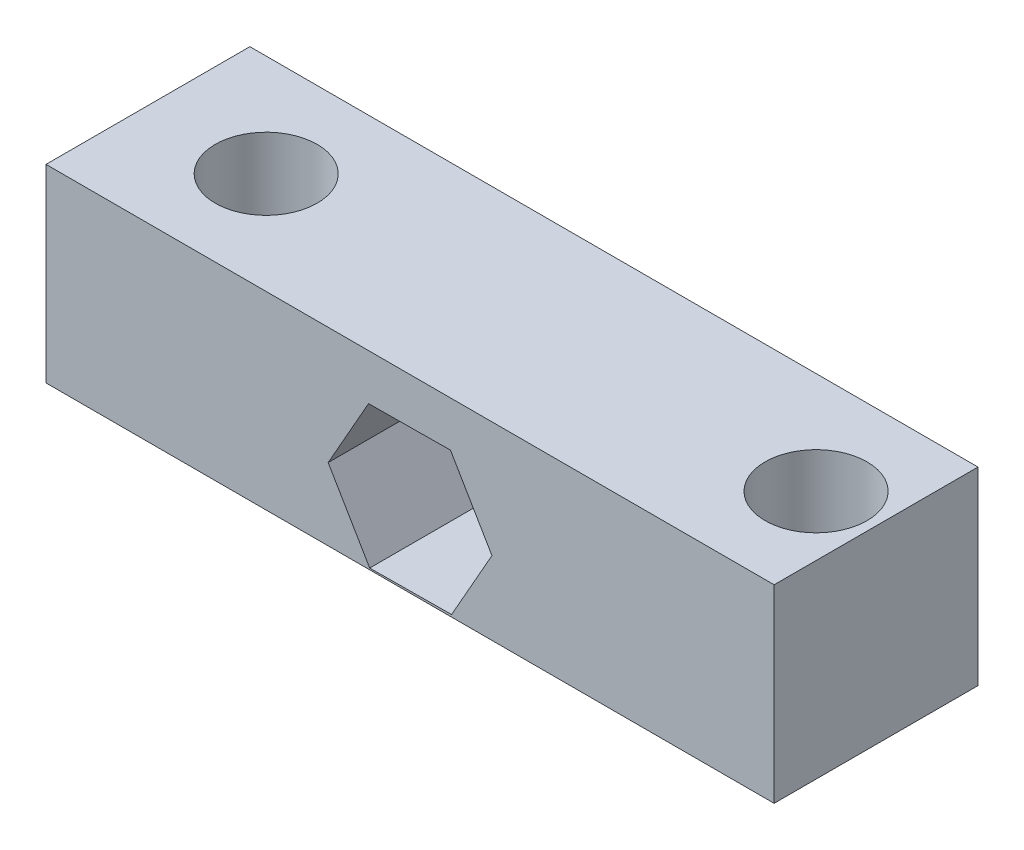
ISO-10303-21;
HEADER;
FILE_DESCRIPTION(('STEP AP214'),'2;1');
FILE_NAME('part.step','',(''),(''),'','','');
FILE_SCHEMA(('AUTOMOTIVE_DESIGN { 1 0 10303 214 1 1 1 1 }'));
ENDSEC;
DATA;
#1=APPLICATION_CONTEXT('core data for automotive mechanical design processes');
#2=APPLICATION_PROTOCOL_DEFINITION('international standard','automotive_design',2000,#1);
#3=PRODUCT_CONTEXT('',#1,'mechanical');
#4=PRODUCT('Part','Part','',(#3));
#5=PRODUCT_RELATED_PRODUCT_CATEGORY('part','',(#4));
#6=PRODUCT_DEFINITION_FORMATION('','',#4);
#7=PRODUCT_DEFINITION_CONTEXT('part definition',#1,'design');
#8=PRODUCT_DEFINITION('design','',#6,#7);
#9=PRODUCT_DEFINITION_SHAPE('','',#8);
#10=(LENGTH_UNIT() NAMED_UNIT(*) SI_UNIT(.MILLI.,.METRE.));
#11=(NAMED_UNIT(*) PLANE_ANGLE_UNIT() SI_UNIT($,.RADIAN.));
#12=(NAMED_UNIT(*) SI_UNIT($,.STERADIAN.) SOLID_ANGLE_UNIT());
#13=UNCERTAINTY_MEASURE_WITH_UNIT(LENGTH_MEASURE(1.E-05),#10,'distance_accuracy_value','');
#14=(GEOMETRIC_REPRESENTATION_CONTEXT(3) GLOBAL_UNCERTAINTY_ASSIGNED_CONTEXT((#13)) GLOBAL_UNIT_ASSIGNED_CONTEXT((#10,
#11,#12)) REPRESENTATION_CONTEXT('',''));
#15=CARTESIAN_POINT('',(0.,0.,0.));
#16=DIRECTION('',(0.,0.,1.));
#17=DIRECTION('',(1.,0.,0.));
#18=AXIS2_PLACEMENT_3D('',#15,#16,#17);
#19=CARTESIAN_POINT('',(0.,6.5,0.));
#20=DIRECTION('',(0.,1.,0.));
#21=DIRECTION('',(0.,0.,1.));
#22=AXIS2_PLACEMENT_3D('',#19,#20,#21);
#23=PLANE('',#22);
#24=CARTESIAN_POINT('',(10.44,6.5,0.));
#25=DIRECTION('',(0.,1.,0.));
#26=DIRECTION('',(0.,0.,1.));
#27=AXIS2_PLACEMENT_3D('',#24,#25,#26);
#28=CIRCLE('',#27,1.75);
#29=CARTESIAN_POINT('',(10.44,6.5,-1.75000000000002));
#30=VERTEX_POINT('',#29);
#31=EDGE_CURVE('E196',#30,#30,#28,.T.);
#32=ORIENTED_EDGE('',*,*,#31,.F.);
#33=EDGE_LOOP('',(#32));
#34=FACE_BOUND('',#33,.T.);
#35=DIRECTION('',(0.,0.,-1.));
#36=VECTOR('',#35,1.);
#37=CARTESIAN_POINT('',(12.5,6.5,-3.5));
#38=LINE('',#37,#36);
#39=CARTESIAN_POINT('',(12.5,6.5,3.5));
#40=VERTEX_POINT('',#39);
#41=CARTESIAN_POINT('',(12.5,6.5,-3.5));
#42=VERTEX_POINT('',#41);
#43=EDGE_CURVE('E204',#40,#42,#38,.T.);
#44=ORIENTED_EDGE('',*,*,#43,.T.);
#45=DIRECTION('',(-1.,0.,0.));
#46=VECTOR('',#45,1.);
#47=CARTESIAN_POINT('',(-12.5,6.5,-3.5));
#48=LINE('',#47,#46);
#49=CARTESIAN_POINT('',(-12.5,6.5,-3.5));
#50=VERTEX_POINT('',#49);
#51=EDGE_CURVE('E208',#42,#50,#48,.T.);
#52=ORIENTED_EDGE('',*,*,#51,.T.);
#53=DIRECTION('',(0.,0.,1.));
#54=VECTOR('',#53,1.);
#55=CARTESIAN_POINT('',(-12.5,6.5,-3.5));
#56=LINE('',#55,#54);
#57=CARTESIAN_POINT('',(-12.5,6.5,3.5));
#58=VERTEX_POINT('',#57);
#59=EDGE_CURVE('E212',#50,#58,#56,.T.);
#60=ORIENTED_EDGE('',*,*,#59,.T.);
#61=DIRECTION('',(1.,0.,0.));
#62=VECTOR('',#61,1.);
#63=CARTESIAN_POINT('',(-12.5,6.5,3.5));
#64=LINE('',#63,#62);
#65=EDGE_CURVE('E215',#58,#40,#64,.T.);
#66=ORIENTED_EDGE('',*,*,#65,.T.);
#67=EDGE_LOOP('',(#44,#52,#60,#66));
#68=FACE_BOUND('',#67,.T.);
#69=CARTESIAN_POINT('',(-8.44,6.5,0.));
#70=DIRECTION('',(0.,1.,0.));
#71=DIRECTION('',(0.,0.,1.));
#72=AXIS2_PLACEMENT_3D('',#69,#70,#71);
#73=CIRCLE('',#72,1.75);
#74=CARTESIAN_POINT('',(-8.44,6.5,-1.75));
#75=VERTEX_POINT('',#74);
#76=EDGE_CURVE('E188',#75,#75,#73,.T.);
#77=ORIENTED_EDGE('',*,*,#76,.F.);
#78=EDGE_LOOP('',(#77));
#79=FACE_BOUND('',#78,.T.);
#80=ADVANCED_FACE('F39',(#34,#68,#79),#23,.T.);
#81=CARTESIAN_POINT('',(0.,0.,0.));
#82=DIRECTION('',(0.,1.,0.));
#83=DIRECTION('',(0.,0.,1.));
#84=AXIS2_PLACEMENT_3D('',#81,#82,#83);
#85=PLANE('',#84);
#86=DIRECTION('',(0.,0.,-1.));
#87=VECTOR('',#86,1.);
#88=CARTESIAN_POINT('',(12.5,0.,-3.5));
#89=LINE('',#88,#87);
#90=CARTESIAN_POINT('',(12.5,0.,3.5));
#91=VERTEX_POINT('',#90);
#92=CARTESIAN_POINT('',(12.5,0.,-3.5));
#93=VERTEX_POINT('',#92);
#94=EDGE_CURVE('E200',#91,#93,#89,.T.);
#95=ORIENTED_EDGE('',*,*,#94,.F.);
#96=DIRECTION('',(1.,0.,0.));
#97=VECTOR('',#96,1.);
#98=CARTESIAN_POINT('',(-12.5,0.,3.5));
#99=LINE('',#98,#97);
#100=CARTESIAN_POINT('',(-12.5,0.,3.5));
#101=VERTEX_POINT('',#100);
#102=EDGE_CURVE('E209',#101,#91,#99,.T.);
#103=ORIENTED_EDGE('',*,*,#102,.F.);
#104=DIRECTION('',(0.,0.,1.));
#105=VECTOR('',#104,1.);
#106=CARTESIAN_POINT('',(-12.5,0.,-3.5));
#107=LINE('',#106,#105);
#108=CARTESIAN_POINT('',(-12.5,0.,-3.5));
#109=VERTEX_POINT('',#108);
#110=EDGE_CURVE('E225',#109,#101,#107,.T.);
#111=ORIENTED_EDGE('',*,*,#110,.F.);
#112=DIRECTION('',(-1.,0.,0.));
#113=VECTOR('',#112,1.);
#114=CARTESIAN_POINT('',(-12.5,0.,-3.5));
#115=LINE('',#114,#113);
#116=EDGE_CURVE('E222',#93,#109,#115,.T.);
#117=ORIENTED_EDGE('',*,*,#116,.F.);
#118=EDGE_LOOP('',(#95,#103,#111,#117));
#119=FACE_BOUND('',#118,.T.);
#120=CARTESIAN_POINT('',(10.44,0.,0.));
#121=DIRECTION('',(0.,1.,0.));
#122=DIRECTION('',(0.,0.,1.));
#123=AXIS2_PLACEMENT_3D('',#120,#121,#122);
#124=CIRCLE('',#123,1.75);
#125=CARTESIAN_POINT('',(10.44,0.,-1.75000000000002));
#126=VERTEX_POINT('',#125);
#127=EDGE_CURVE('E192',#126,#126,#124,.T.);
#128=ORIENTED_EDGE('',*,*,#127,.T.);
#129=EDGE_LOOP('',(#128));
#130=FACE_BOUND('',#129,.T.);
#131=CARTESIAN_POINT('',(-8.44,0.,0.));
#132=DIRECTION('',(0.,1.,0.));
#133=DIRECTION('',(0.,0.,1.));
#134=AXIS2_PLACEMENT_3D('',#131,#132,#133);
#135=CIRCLE('',#134,1.75);
#136=CARTESIAN_POINT('',(-8.44,0.,-1.75));
#137=VERTEX_POINT('',#136);
#138=EDGE_CURVE('E177',#137,#137,#135,.T.);
#139=ORIENTED_EDGE('',*,*,#138,.T.);
#140=EDGE_LOOP('',(#139));
#141=FACE_BOUND('',#140,.T.);
#142=ADVANCED_FACE('F248',(#119,#130,#141),#85,.F.);
#143=CARTESIAN_POINT('',(12.5,6.5,-3.5));
#144=DIRECTION('',(-1.,0.,0.));
#145=DIRECTION('',(0.,0.,1.));
#146=AXIS2_PLACEMENT_3D('',#143,#144,#145);
#147=PLANE('',#146);
#148=ORIENTED_EDGE('',*,*,#94,.T.);
#149=DIRECTION('',(0.,-1.,0.));
#150=VECTOR('',#149,1.);
#151=CARTESIAN_POINT('',(12.5,6.5,-3.5));
#152=LINE('',#151,#150);
#153=EDGE_CURVE('E11',#42,#93,#152,.T.);
#154=ORIENTED_EDGE('',*,*,#153,.F.);
#155=ORIENTED_EDGE('',*,*,#43,.F.);
#156=DIRECTION('',(0.,-1.,0.));
#157=VECTOR('',#156,1.);
#158=CARTESIAN_POINT('',(12.5,6.5,3.5));
#159=LINE('',#158,#157);
#160=EDGE_CURVE('E218',#40,#91,#159,.T.);
#161=ORIENTED_EDGE('',*,*,#160,.T.);
#162=EDGE_LOOP('',(#148,#154,#155,#161));
#163=FACE_BOUND('',#162,.T.);
#164=ADVANCED_FACE('F41',(#163),#147,.F.);
#165=CARTESIAN_POINT('',(-12.5,6.5,-3.5));
#166=DIRECTION('',(0.,0.,1.));
#167=DIRECTION('',(1.,0.,0.));
#168=AXIS2_PLACEMENT_3D('',#165,#166,#167);
#169=PLANE('',#168);
#170=DIRECTION('',(0.5070201265634,-0.861934215157766,0.));
#171=VECTOR('',#170,1.);
#172=CARTESIAN_POINT('',(-2.81160299687287,2.4771544028564,-3.5));
#173=LINE('',#172,#171);
#174=CARTESIAN_POINT('',(-2.81160299687287,2.4771544028564,-3.5));
#175=VERTEX_POINT('',#174);
#176=CARTESIAN_POINT('',(-1.38601663094545,0.0536575807798391,-3.5));
#177=VERTEX_POINT('',#176);
#178=EDGE_CURVE('E170',#175,#177,#173,.T.);
#179=ORIENTED_EDGE('',*,*,#178,.T.);
#180=DIRECTION('',(0.999966989999327,0.00812520225502321,0.));
#181=VECTOR('',#180,1.);
#182=CARTESIAN_POINT('',(-1.38601663094545,0.0536575807798391,-3.5));
#183=LINE('',#182,#181);
#184=CARTESIAN_POINT('',(1.42558636592741,0.0765031779234376,-3.5));
#185=VERTEX_POINT('',#184);
#186=EDGE_CURVE('E153',#177,#185,#183,.T.);
#187=ORIENTED_EDGE('',*,*,#186,.T.);
#188=DIRECTION('',(0.492946863435927,0.870059417412789,0.));
#189=VECTOR('',#188,1.);
#190=CARTESIAN_POINT('',(1.42558636592741,0.0765031779234376,-3.5));
#191=LINE('',#190,#189);
#192=CARTESIAN_POINT('',(2.81160299687287,2.5228455971436,-3.5));
#193=VERTEX_POINT('',#192);
#194=EDGE_CURVE('E157',#185,#193,#191,.T.);
#195=ORIENTED_EDGE('',*,*,#194,.T.);
#196=DIRECTION('',(-0.5070201265634,0.861934215157766,0.));
#197=VECTOR('',#196,1.);
#198=CARTESIAN_POINT('',(2.81160299687287,2.5228455971436,-3.5));
#199=LINE('',#198,#197);
#200=CARTESIAN_POINT('',(1.38601663094545,4.94634241922016,-3.5));
#201=VERTEX_POINT('',#200);
#202=EDGE_CURVE('E55',#193,#201,#199,.T.);
#203=ORIENTED_EDGE('',*,*,#202,.T.);
#204=DIRECTION('',(-0.999966989999327,-0.00812520225502306,0.));
#205=VECTOR('',#204,1.);
#206=CARTESIAN_POINT('',(1.38601663094545,4.94634241922016,-3.5));
#207=LINE('',#206,#205);
#208=CARTESIAN_POINT('',(-1.42558636592741,4.92349682207657,-3.5));
#209=VERTEX_POINT('',#208);
#210=EDGE_CURVE('E162',#201,#209,#207,.T.);
#211=ORIENTED_EDGE('',*,*,#210,.T.);
#212=DIRECTION('',(-0.492946863435927,-0.870059417412789,0.));
#213=VECTOR('',#212,1.);
#214=CARTESIAN_POINT('',(-1.42558636592741,4.92349682207657,-3.5));
#215=LINE('',#214,#213);
#216=EDGE_CURVE('E166',#209,#175,#215,.T.);
#217=ORIENTED_EDGE('',*,*,#216,.T.);
#218=EDGE_LOOP('',(#179,#187,#195,#203,#211,#217));
#219=FACE_BOUND('',#218,.T.);
#220=ORIENTED_EDGE('',*,*,#116,.T.);
#221=DIRECTION('',(0.,-1.,0.));
#222=VECTOR('',#221,1.);
#223=CARTESIAN_POINT('',(-12.5,6.5,-3.5));
#224=LINE('',#223,#222);
#225=EDGE_CURVE('E48',#50,#109,#224,.T.);
#226=ORIENTED_EDGE('',*,*,#225,.F.);
#227=ORIENTED_EDGE('',*,*,#51,.F.);
#228=ORIENTED_EDGE('',*,*,#153,.T.);
#229=EDGE_LOOP('',(#220,#226,#227,#228));
#230=FACE_BOUND('',#229,.T.);
#231=ADVANCED_FACE('F257',(#219,#230),#169,.F.);
#232=CARTESIAN_POINT('',(-12.5,6.5,-3.5));
#233=DIRECTION('',(1.,0.,0.));
#234=DIRECTION('',(0.,0.,-1.));
#235=AXIS2_PLACEMENT_3D('',#232,#233,#234);
#236=PLANE('',#235);
#237=ORIENTED_EDGE('',*,*,#110,.T.);
#238=DIRECTION('',(0.,-1.,0.));
#239=VECTOR('',#238,1.);
#240=CARTESIAN_POINT('',(-12.5,6.5,3.5));
#241=LINE('',#240,#239);
#242=EDGE_CURVE('E233',#58,#101,#241,.T.);
#243=ORIENTED_EDGE('',*,*,#242,.F.);
#244=ORIENTED_EDGE('',*,*,#59,.F.);
#245=ORIENTED_EDGE('',*,*,#225,.T.);
#246=EDGE_LOOP('',(#237,#243,#244,#245));
#247=FACE_BOUND('',#246,.T.);
#248=ADVANCED_FACE('F242',(#247),#236,.F.);
#249=CARTESIAN_POINT('',(-12.5,6.5,3.5));
#250=DIRECTION('',(0.,0.,-1.));
#251=DIRECTION('',(-1.,0.,0.));
#252=AXIS2_PLACEMENT_3D('',#249,#250,#251);
#253=PLANE('',#252);
#254=DIRECTION('',(0.492946863435927,0.870059417412789,0.));
#255=VECTOR('',#254,1.);
#256=CARTESIAN_POINT('',(1.42558636592741,0.0765031779234376,3.5));
#257=LINE('',#256,#255);
#258=CARTESIAN_POINT('',(1.42558636592742,0.0765031779234376,3.5));
#259=VERTEX_POINT('',#258);
#260=CARTESIAN_POINT('',(2.81160299687287,2.5228455971436,3.5));
#261=VERTEX_POINT('',#260);
#262=EDGE_CURVE('E129',#259,#261,#257,.T.);
#263=ORIENTED_EDGE('',*,*,#262,.F.);
#264=DIRECTION('',(0.999966989999327,0.00812520225502321,0.));
#265=VECTOR('',#264,1.);
#266=CARTESIAN_POINT('',(-1.38601663094545,0.0536575807798391,3.5));
#267=LINE('',#266,#265);
#268=CARTESIAN_POINT('',(-1.38601663094545,0.0536575807798391,3.5));
#269=VERTEX_POINT('',#268);
#270=EDGE_CURVE('E63',#269,#259,#267,.T.);
#271=ORIENTED_EDGE('',*,*,#270,.F.);
#272=DIRECTION('',(0.5070201265634,-0.861934215157766,0.));
#273=VECTOR('',#272,1.);
#274=CARTESIAN_POINT('',(-2.81160299687287,2.4771544028564,3.5));
#275=LINE('',#274,#273);
#276=CARTESIAN_POINT('',(-2.81160299687287,2.4771544028564,3.5));
#277=VERTEX_POINT('',#276);
#278=EDGE_CURVE('E149',#277,#269,#275,.T.);
#279=ORIENTED_EDGE('',*,*,#278,.F.);
#280=DIRECTION('',(-0.492946863435927,-0.870059417412789,0.));
#281=VECTOR('',#280,1.);
#282=CARTESIAN_POINT('',(-1.42558636592741,4.92349682207657,3.5));
#283=LINE('',#282,#281);
#284=CARTESIAN_POINT('',(-1.42558636592741,4.92349682207657,3.5));
#285=VERTEX_POINT('',#284);
#286=EDGE_CURVE('E142',#285,#277,#283,.T.);
#287=ORIENTED_EDGE('',*,*,#286,.F.);
#288=DIRECTION('',(-0.999966989999327,-0.00812520225502306,0.));
#289=VECTOR('',#288,1.);
#290=CARTESIAN_POINT('',(1.38601663094545,4.94634241922016,3.5));
#291=LINE('',#290,#289);
#292=CARTESIAN_POINT('',(1.38601663094545,4.94634241922016,3.5));
#293=VERTEX_POINT('',#292);
#294=EDGE_CURVE('E138',#293,#285,#291,.T.);
#295=ORIENTED_EDGE('',*,*,#294,.F.);
#296=DIRECTION('',(-0.5070201265634,0.861934215157766,0.));
#297=VECTOR('',#296,1.);
#298=CARTESIAN_POINT('',(2.81160299687287,2.5228455971436,3.5));
#299=LINE('',#298,#297);
#300=EDGE_CURVE('E119',#261,#293,#299,.T.);
#301=ORIENTED_EDGE('',*,*,#300,.F.);
#302=EDGE_LOOP('',(#263,#271,#279,#287,#295,#301));
#303=FACE_BOUND('',#302,.T.);
#304=ORIENTED_EDGE('',*,*,#102,.T.);
#305=ORIENTED_EDGE('',*,*,#160,.F.);
#306=ORIENTED_EDGE('',*,*,#65,.F.);
#307=ORIENTED_EDGE('',*,*,#242,.T.);
#308=EDGE_LOOP('',(#304,#305,#306,#307));
#309=FACE_BOUND('',#308,.T.);
#310=ADVANCED_FACE('F134',(#303,#309),#253,.F.);
#311=CARTESIAN_POINT('',(10.44,6.5,0.));
#312=DIRECTION('',(0.,-1.,0.));
#313=DIRECTION('',(0.,0.,-1.));
#314=AXIS2_PLACEMENT_3D('',#311,#312,#313);
#315=CYLINDRICAL_SURFACE('',#314,1.75);
#316=CARTESIAN_POINT('',(10.44,6.5,-1.75000000000002));
#317=CARTESIAN_POINT('',(10.44,6.43229166666667,-1.75000000000002));
#318=CARTESIAN_POINT('',(10.44,6.36458333333333,-1.75000000000002));
#319=CARTESIAN_POINT('',(10.44,6.22916666666667,-1.75000000000002));
#320=CARTESIAN_POINT('',(10.44,6.16145833333333,-1.75000000000002));
#321=CARTESIAN_POINT('',(10.44,6.02604166666667,-1.75000000000002));
#322=CARTESIAN_POINT('',(10.44,5.95833333333333,-1.75000000000002));
#323=CARTESIAN_POINT('',(10.44,5.82291666666667,-1.75000000000002));
#324=CARTESIAN_POINT('',(10.44,5.75520833333333,-1.75000000000002));
#325=CARTESIAN_POINT('',(10.44,5.61979166666667,-1.75000000000002));
#326=CARTESIAN_POINT('',(10.44,5.55208333333333,-1.75000000000002));
#327=CARTESIAN_POINT('',(10.44,5.41666666666667,-1.75000000000002));
#328=CARTESIAN_POINT('',(10.44,5.34895833333333,-1.75000000000002));
#329=CARTESIAN_POINT('',(10.44,5.21354166666667,-1.75000000000002));
#330=CARTESIAN_POINT('',(10.44,5.14583333333333,-1.75000000000002));
#331=CARTESIAN_POINT('',(10.44,5.01041666666667,-1.75000000000002));
#332=CARTESIAN_POINT('',(10.44,4.94270833333333,-1.75000000000002));
#333=CARTESIAN_POINT('',(10.44,4.80729166666667,-1.75000000000002));
#334=CARTESIAN_POINT('',(10.44,4.73958333333333,-1.75000000000002));
#335=CARTESIAN_POINT('',(10.44,4.60416666666667,-1.75000000000002));
#336=CARTESIAN_POINT('',(10.44,4.53645833333333,-1.75000000000002));
#337=CARTESIAN_POINT('',(10.44,4.40104166666667,-1.75000000000002));
#338=CARTESIAN_POINT('',(10.44,4.33333333333333,-1.75000000000002));
#339=CARTESIAN_POINT('',(10.44,4.19791666666667,-1.75000000000002));
#340=CARTESIAN_POINT('',(10.44,4.13020833333333,-1.75000000000002));
#341=CARTESIAN_POINT('',(10.44,3.99479166666667,-1.75000000000002));
#342=CARTESIAN_POINT('',(10.44,3.92708333333333,-1.75000000000002));
#343=CARTESIAN_POINT('',(10.44,3.79166666666667,-1.75000000000002));
#344=CARTESIAN_POINT('',(10.44,3.72395833333333,-1.75000000000002));
#345=CARTESIAN_POINT('',(10.44,3.58854166666667,-1.75000000000002));
#346=CARTESIAN_POINT('',(10.44,3.52083333333333,-1.75000000000002));
#347=CARTESIAN_POINT('',(10.44,3.38541666666667,-1.75000000000002));
#348=CARTESIAN_POINT('',(10.44,3.31770833333333,-1.75000000000002));
#349=CARTESIAN_POINT('',(10.44,3.18229166666667,-1.75000000000002));
#350=CARTESIAN_POINT('',(10.44,3.11458333333333,-1.75000000000002));
#351=CARTESIAN_POINT('',(10.44,2.97916666666667,-1.75000000000002));
#352=CARTESIAN_POINT('',(10.44,2.91145833333333,-1.75000000000002));
#353=CARTESIAN_POINT('',(10.44,2.77604166666667,-1.75000000000002));
#354=CARTESIAN_POINT('',(10.44,2.70833333333333,-1.75000000000002));
#355=CARTESIAN_POINT('',(10.44,2.57291666666667,-1.75000000000002));
#356=CARTESIAN_POINT('',(10.44,2.50520833333333,-1.75000000000002));
#357=CARTESIAN_POINT('',(10.44,2.36979166666667,-1.75000000000002));
#358=CARTESIAN_POINT('',(10.44,2.30208333333333,-1.75000000000002));
#359=CARTESIAN_POINT('',(10.44,2.16666666666667,-1.75000000000002));
#360=CARTESIAN_POINT('',(10.44,2.09895833333333,-1.75000000000002));
#361=CARTESIAN_POINT('',(10.44,1.96354166666667,-1.75000000000002));
#362=CARTESIAN_POINT('',(10.44,1.89583333333333,-1.75000000000002));
#363=CARTESIAN_POINT('',(10.44,1.76041666666667,-1.75000000000002));
#364=CARTESIAN_POINT('',(10.44,1.69270833333333,-1.75000000000002));
#365=CARTESIAN_POINT('',(10.44,1.55729166666667,-1.75000000000002));
#366=CARTESIAN_POINT('',(10.44,1.48958333333333,-1.75000000000002));
#367=CARTESIAN_POINT('',(10.44,1.35416666666667,-1.75000000000002));
#368=CARTESIAN_POINT('',(10.44,1.28645833333333,-1.75000000000002));
#369=CARTESIAN_POINT('',(10.44,1.15104166666667,-1.75000000000002));
#370=CARTESIAN_POINT('',(10.44,1.08333333333333,-1.75000000000002));
#371=CARTESIAN_POINT('',(10.44,0.947916666666667,-1.75000000000002));
#372=CARTESIAN_POINT('',(10.44,0.880208333333333,-1.75000000000002));
#373=CARTESIAN_POINT('',(10.44,0.744791666666667,-1.75000000000002));
#374=CARTESIAN_POINT('',(10.44,0.677083333333333,-1.75000000000002));
#375=CARTESIAN_POINT('',(10.44,0.541666666666667,-1.75000000000002));
#376=CARTESIAN_POINT('',(10.44,0.473958333333333,-1.75000000000002));
#377=CARTESIAN_POINT('',(10.44,0.338541666666667,-1.75000000000002));
#378=CARTESIAN_POINT('',(10.44,0.270833333333334,-1.75000000000002));
#379=CARTESIAN_POINT('',(10.44,0.135416666666667,-1.75000000000002));
#380=CARTESIAN_POINT('',(10.44,0.0677083333333334,-1.75000000000002));
#381=CARTESIAN_POINT('',(10.44,0.,-1.75000000000002));
#382=B_SPLINE_CURVE_WITH_KNOTS('',3,(#316,#317,#318,#319,#320,#321,#322,#323,#324,#325,#326,
#327,#328,#329,#330,#331,#332,#333,#334,#335,#336,#337,#338,#339,#340,#341,#342,#343,#344,#345,
#346,#347,#348,#349,#350,#351,#352,#353,#354,#355,#356,#357,#358,#359,#360,#361,#362,#363,#364,
#365,#366,#367,#368,#369,#370,#371,#372,#373,#374,#375,#376,#377,#378,#379,#380,#381),
.UNSPECIFIED.,.F.,.F.,(4,2,2,2,2,2,2,2,2,2,2,2,2,2,2,2,2,2,2,2,2,2,2,2,2,2,2,2,2,2,2,2,4),(0.,
0.203124999999999,0.40625,0.609375,0.812499999999999,1.015625,1.21875,1.421875,1.625,1.828125,
2.03125,2.234375,2.4375,2.640625,2.84375,3.046875,3.25,3.453125,3.65625,3.859375,4.0625,
4.265625,4.46875,4.671875,4.875,5.078125,5.28125,5.484375,5.6875,5.890625,6.09375,6.296875,6.5),.UNSPECIFIED.);
#383=EDGE_CURVE('BSEAM274',#30,#126,#382,.T.);
#384=ORIENTED_EDGE('',*,*,#31,.T.);
#385=ORIENTED_EDGE('',*,*,#127,.F.);
#386=ORIENTED_EDGE('',*,*,#383,.T.);
#387=ORIENTED_EDGE('',*,*,#383,.F.);
#388=EDGE_LOOP('',(#384,#386,#385,#387));
#389=FACE_BOUND('',#388,.T.);
#390=ADVANCED_FACE('F274',(#389),#315,.F.);
#391=CARTESIAN_POINT('',(-8.44,6.5,0.));
#392=DIRECTION('',(0.,-1.,0.));
#393=DIRECTION('',(0.,0.,-1.));
#394=AXIS2_PLACEMENT_3D('',#391,#392,#393);
#395=CYLINDRICAL_SURFACE('',#394,1.75);
#396=CARTESIAN_POINT('',(-8.44,6.5,-1.75));
#397=CARTESIAN_POINT('',(-8.44,6.43229166666667,-1.75));
#398=CARTESIAN_POINT('',(-8.44,6.36458333333333,-1.75));
#399=CARTESIAN_POINT('',(-8.44,6.22916666666667,-1.75));
#400=CARTESIAN_POINT('',(-8.44,6.16145833333333,-1.75));
#401=CARTESIAN_POINT('',(-8.44,6.02604166666667,-1.75));
#402=CARTESIAN_POINT('',(-8.44,5.95833333333333,-1.75));
#403=CARTESIAN_POINT('',(-8.44,5.82291666666667,-1.75));
#404=CARTESIAN_POINT('',(-8.44,5.75520833333333,-1.75));
#405=CARTESIAN_POINT('',(-8.44,5.61979166666667,-1.75));
#406=CARTESIAN_POINT('',(-8.44,5.55208333333333,-1.75));
#407=CARTESIAN_POINT('',(-8.44,5.41666666666667,-1.75));
#408=CARTESIAN_POINT('',(-8.44,5.34895833333333,-1.75));
#409=CARTESIAN_POINT('',(-8.44,5.21354166666667,-1.75));
#410=CARTESIAN_POINT('',(-8.44,5.14583333333333,-1.75));
#411=CARTESIAN_POINT('',(-8.44,5.01041666666667,-1.75));
#412=CARTESIAN_POINT('',(-8.44,4.94270833333333,-1.75));
#413=CARTESIAN_POINT('',(-8.44,4.80729166666667,-1.75));
#414=CARTESIAN_POINT('',(-8.44,4.73958333333333,-1.75));
#415=CARTESIAN_POINT('',(-8.44,4.60416666666667,-1.75));
#416=CARTESIAN_POINT('',(-8.44,4.53645833333333,-1.75));
#417=CARTESIAN_POINT('',(-8.44,4.40104166666667,-1.75));
#418=CARTESIAN_POINT('',(-8.44,4.33333333333333,-1.75));
#419=CARTESIAN_POINT('',(-8.44,4.19791666666667,-1.75));
#420=CARTESIAN_POINT('',(-8.44,4.13020833333333,-1.75));
#421=CARTESIAN_POINT('',(-8.44,3.99479166666667,-1.75));
#422=CARTESIAN_POINT('',(-8.44,3.92708333333333,-1.75));
#423=CARTESIAN_POINT('',(-8.44,3.79166666666667,-1.75));
#424=CARTESIAN_POINT('',(-8.44,3.72395833333333,-1.75));
#425=CARTESIAN_POINT('',(-8.44,3.58854166666667,-1.75));
#426=CARTESIAN_POINT('',(-8.44,3.52083333333333,-1.75));
#427=CARTESIAN_POINT('',(-8.44,3.38541666666667,-1.75));
#428=CARTESIAN_POINT('',(-8.44,3.31770833333333,-1.75));
#429=CARTESIAN_POINT('',(-8.44,3.18229166666667,-1.75));
#430=CARTESIAN_POINT('',(-8.44,3.11458333333333,-1.75));
#431=CARTESIAN_POINT('',(-8.44,2.97916666666667,-1.75));
#432=CARTESIAN_POINT('',(-8.44,2.91145833333333,-1.75));
#433=CARTESIAN_POINT('',(-8.44,2.77604166666667,-1.75));
#434=CARTESIAN_POINT('',(-8.44,2.70833333333333,-1.75));
#435=CARTESIAN_POINT('',(-8.44,2.57291666666667,-1.75));
#436=CARTESIAN_POINT('',(-8.44,2.50520833333333,-1.75));
#437=CARTESIAN_POINT('',(-8.44,2.36979166666667,-1.75));
#438=CARTESIAN_POINT('',(-8.44,2.30208333333333,-1.75));
#439=CARTESIAN_POINT('',(-8.44,2.16666666666667,-1.75));
#440=CARTESIAN_POINT('',(-8.44,2.09895833333333,-1.75));
#441=CARTESIAN_POINT('',(-8.44,1.96354166666667,-1.75));
#442=CARTESIAN_POINT('',(-8.44,1.89583333333333,-1.75));
#443=CARTESIAN_POINT('',(-8.44,1.76041666666667,-1.75));
#444=CARTESIAN_POINT('',(-8.44,1.69270833333333,-1.75));
#445=CARTESIAN_POINT('',(-8.44,1.55729166666667,-1.75));
#446=CARTESIAN_POINT('',(-8.44,1.48958333333333,-1.75));
#447=CARTESIAN_POINT('',(-8.44,1.35416666666667,-1.75));
#448=CARTESIAN_POINT('',(-8.44,1.28645833333333,-1.75));
#449=CARTESIAN_POINT('',(-8.44,1.15104166666667,-1.75));
#450=CARTESIAN_POINT('',(-8.44,1.08333333333333,-1.75));
#451=CARTESIAN_POINT('',(-8.44,0.947916666666667,-1.75));
#452=CARTESIAN_POINT('',(-8.44,0.880208333333333,-1.75));
#453=CARTESIAN_POINT('',(-8.44,0.744791666666667,-1.75));
#454=CARTESIAN_POINT('',(-8.44,0.677083333333333,-1.75));
#455=CARTESIAN_POINT('',(-8.44,0.541666666666667,-1.75));
#456=CARTESIAN_POINT('',(-8.44,0.473958333333333,-1.75));
#457=CARTESIAN_POINT('',(-8.44,0.338541666666667,-1.75));
#458=CARTESIAN_POINT('',(-8.44,0.270833333333334,-1.75));
#459=CARTESIAN_POINT('',(-8.44,0.135416666666667,-1.75));
#460=CARTESIAN_POINT('',(-8.44,0.0677083333333334,-1.75));
#461=CARTESIAN_POINT('',(-8.44,0.,-1.75));
#462=B_SPLINE_CURVE_WITH_KNOTS('',3,(#396,#397,#398,#399,#400,#401,#402,#403,#404,#405,#406,
#407,#408,#409,#410,#411,#412,#413,#414,#415,#416,#417,#418,#419,#420,#421,#422,#423,#424,#425,
#426,#427,#428,#429,#430,#431,#432,#433,#434,#435,#436,#437,#438,#439,#440,#441,#442,#443,#444,
#445,#446,#447,#448,#449,#450,#451,#452,#453,#454,#455,#456,#457,#458,#459,#460,#461),
.UNSPECIFIED.,.F.,.F.,(4,2,2,2,2,2,2,2,2,2,2,2,2,2,2,2,2,2,2,2,2,2,2,2,2,2,2,2,2,2,2,2,4),(0.,
0.203124999999999,0.40625,0.609375,0.812499999999999,1.015625,1.21875,1.421875,1.625,1.828125,
2.03125,2.234375,2.4375,2.640625,2.84375,3.046875,3.25,3.453125,3.65625,3.859375,4.0625,
4.265625,4.46875,4.671875,4.875,5.078125,5.28125,5.484375,5.6875,5.890625,6.09375,6.296875,6.5),.UNSPECIFIED.);
#463=EDGE_CURVE('BSEAM281',#75,#137,#462,.T.);
#464=ORIENTED_EDGE('',*,*,#76,.T.);
#465=ORIENTED_EDGE('',*,*,#138,.F.);
#466=ORIENTED_EDGE('',*,*,#463,.T.);
#467=ORIENTED_EDGE('',*,*,#463,.F.);
#468=EDGE_LOOP('',(#464,#466,#465,#467));
#469=FACE_BOUND('',#468,.T.);
#470=ADVANCED_FACE('F281',(#469),#395,.F.);
#471=CARTESIAN_POINT('',(-1.38601663094545,0.0536575807798391,-3.5));
#472=DIRECTION('',(0.00812520225502321,-0.999966989999328,0.));
#473=DIRECTION('',(0.999966989999328,0.00812520225502321,0.));
#474=AXIS2_PLACEMENT_3D('',#471,#472,#473);
#475=PLANE('',#474);
#476=DIRECTION('',(0.,0.,1.));
#477=VECTOR('',#476,1.);
#478=CARTESIAN_POINT('',(1.42558636592741,0.0765031779234376,-3.5));
#479=LINE('',#478,#477);
#480=EDGE_CURVE('E126',#185,#259,#479,.T.);
#481=ORIENTED_EDGE('',*,*,#480,.F.);
#482=ORIENTED_EDGE('',*,*,#186,.F.);
#483=DIRECTION('',(0.,0.,1.));
#484=VECTOR('',#483,1.);
#485=CARTESIAN_POINT('',(-1.38601663094545,0.0536575807798391,-3.5));
#486=LINE('',#485,#484);
#487=EDGE_CURVE('E174',#177,#269,#486,.T.);
#488=ORIENTED_EDGE('',*,*,#487,.T.);
#489=ORIENTED_EDGE('',*,*,#270,.T.);
#490=EDGE_LOOP('',(#481,#482,#488,#489));
#491=FACE_BOUND('',#490,.T.);
#492=ADVANCED_FACE('F286',(#491),#475,.F.);
#493=CARTESIAN_POINT('',(-2.81160299687287,2.4771544028564,-3.5));
#494=DIRECTION('',(-0.861934215157766,-0.5070201265634,0.));
#495=DIRECTION('',(0.5070201265634,-0.861934215157766,0.));
#496=AXIS2_PLACEMENT_3D('',#493,#494,#495);
#497=PLANE('',#496);
#498=ORIENTED_EDGE('',*,*,#487,.F.);
#499=ORIENTED_EDGE('',*,*,#178,.F.);
#500=DIRECTION('',(0.,0.,1.));
#501=VECTOR('',#500,1.);
#502=CARTESIAN_POINT('',(-2.81160299687287,2.4771544028564,-3.5));
#503=LINE('',#502,#501);
#504=EDGE_CURVE('E178',#175,#277,#503,.T.);
#505=ORIENTED_EDGE('',*,*,#504,.T.);
#506=ORIENTED_EDGE('',*,*,#278,.T.);
#507=EDGE_LOOP('',(#498,#499,#505,#506));
#508=FACE_BOUND('',#507,.T.);
#509=ADVANCED_FACE('F296',(#508),#497,.F.);
#510=CARTESIAN_POINT('',(-1.42558636592741,4.92349682207657,-3.5));
#511=DIRECTION('',(-0.870059417412789,0.492946863435927,0.));
#512=DIRECTION('',(-0.492946863435927,-0.870059417412789,0.));
#513=AXIS2_PLACEMENT_3D('',#510,#511,#512);
#514=PLANE('',#513);
#515=ORIENTED_EDGE('',*,*,#504,.F.);
#516=ORIENTED_EDGE('',*,*,#216,.F.);
#517=DIRECTION('',(0.,0.,1.));
#518=VECTOR('',#517,1.);
#519=CARTESIAN_POINT('',(-1.42558636592741,4.92349682207657,-3.5));
#520=LINE('',#519,#518);
#521=EDGE_CURVE('E181',#209,#285,#520,.T.);
#522=ORIENTED_EDGE('',*,*,#521,.T.);
#523=ORIENTED_EDGE('',*,*,#286,.T.);
#524=EDGE_LOOP('',(#515,#516,#522,#523));
#525=FACE_BOUND('',#524,.T.);
#526=ADVANCED_FACE('F306',(#525),#514,.F.);
#527=CARTESIAN_POINT('',(1.38601663094545,4.94634241922016,-3.5));
#528=DIRECTION('',(-0.00812520225502306,0.999966989999328,0.));
#529=DIRECTION('',(-0.999966989999328,-0.00812520225502306,0.));
#530=AXIS2_PLACEMENT_3D('',#527,#528,#529);
#531=PLANE('',#530);
#532=ORIENTED_EDGE('',*,*,#521,.F.);
#533=ORIENTED_EDGE('',*,*,#210,.F.);
#534=DIRECTION('',(0.,0.,1.));
#535=VECTOR('',#534,1.);
#536=CARTESIAN_POINT('',(1.38601663094545,4.94634241922016,-3.5));
#537=LINE('',#536,#535);
#538=EDGE_CURVE('E125',#201,#293,#537,.T.);
#539=ORIENTED_EDGE('',*,*,#538,.T.);
#540=ORIENTED_EDGE('',*,*,#294,.T.);
#541=EDGE_LOOP('',(#532,#533,#539,#540));
#542=FACE_BOUND('',#541,.T.);
#543=ADVANCED_FACE('F303',(#542),#531,.F.);
#544=CARTESIAN_POINT('',(2.81160299687287,2.5228455971436,-3.5));
#545=DIRECTION('',(0.861934215157766,0.5070201265634,0.));
#546=DIRECTION('',(-0.5070201265634,0.861934215157766,0.));
#547=AXIS2_PLACEMENT_3D('',#544,#545,#546);
#548=PLANE('',#547);
#549=ORIENTED_EDGE('',*,*,#538,.F.);
#550=ORIENTED_EDGE('',*,*,#202,.F.);
#551=DIRECTION('',(0.,0.,1.));
#552=VECTOR('',#551,1.);
#553=CARTESIAN_POINT('',(2.81160299687287,2.5228455971436,-3.5));
#554=LINE('',#553,#552);
#555=EDGE_CURVE('E115',#193,#261,#554,.T.);
#556=ORIENTED_EDGE('',*,*,#555,.T.);
#557=ORIENTED_EDGE('',*,*,#300,.T.);
#558=EDGE_LOOP('',(#549,#550,#556,#557));
#559=FACE_BOUND('',#558,.T.);
#560=ADVANCED_FACE('F117',(#559),#548,.F.);
#561=CARTESIAN_POINT('',(1.42558636592741,0.0765031779234376,-3.5));
#562=DIRECTION('',(0.870059417412789,-0.492946863435927,0.));
#563=DIRECTION('',(0.492946863435927,0.870059417412789,0.));
#564=AXIS2_PLACEMENT_3D('',#561,#562,#563);
#565=PLANE('',#564);
#566=ORIENTED_EDGE('',*,*,#555,.F.);
#567=ORIENTED_EDGE('',*,*,#194,.F.);
#568=ORIENTED_EDGE('',*,*,#480,.T.);
#569=ORIENTED_EDGE('',*,*,#262,.T.);
#570=EDGE_LOOP('',(#566,#567,#568,#569));
#571=FACE_BOUND('',#570,.T.);
#572=ADVANCED_FACE('F130',(#571),#565,.F.);
#573=CLOSED_SHELL('',(#80,#142,#164,#231,#248,#310,#390,#470,#492,#509,#526,#543,#560,#572));
#574=MANIFOLD_SOLID_BREP('B2',#573);
#575=ADVANCED_BREP_SHAPE_REPRESENTATION('',(#18,#574),#14);
#576=SHAPE_DEFINITION_REPRESENTATION(#9,#575);
ENDSEC;
END-ISO-10303-21;
